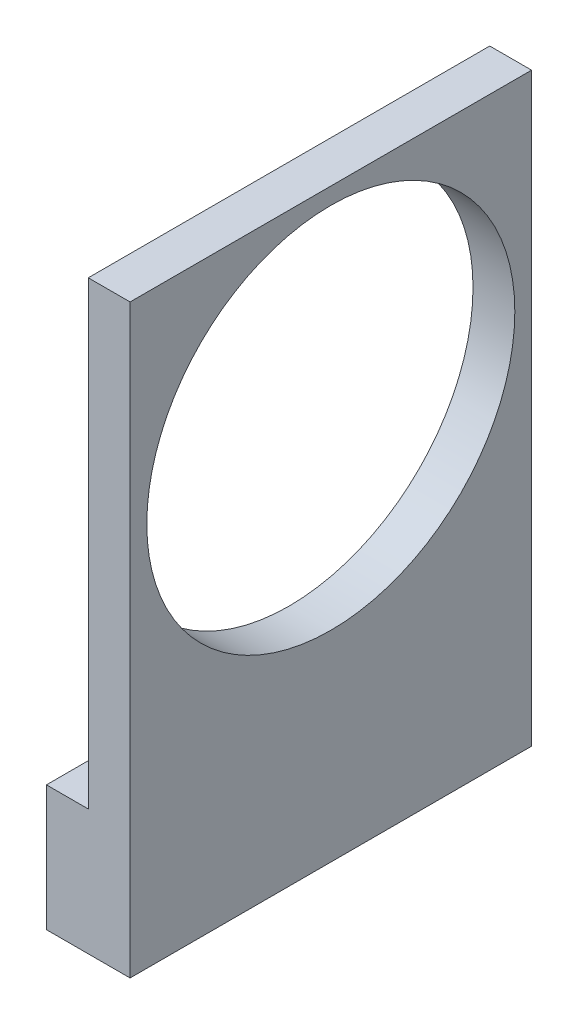
ISO-10303-21;
HEADER;
FILE_DESCRIPTION(('STEP AP214'),'2;1');
FILE_NAME('part.step','',(''),(''),'','','');
FILE_SCHEMA(('AUTOMOTIVE_DESIGN { 1 0 10303 214 1 1 1 1 }'));
ENDSEC;
DATA;
#1=APPLICATION_CONTEXT('core data for automotive mechanical design processes');
#2=APPLICATION_PROTOCOL_DEFINITION('international standard','automotive_design',2000,#1);
#3=PRODUCT_CONTEXT('',#1,'mechanical');
#4=PRODUCT('Part','Part','',(#3));
#5=PRODUCT_RELATED_PRODUCT_CATEGORY('part','',(#4));
#6=PRODUCT_DEFINITION_FORMATION('','',#4);
#7=PRODUCT_DEFINITION_CONTEXT('part definition',#1,'design');
#8=PRODUCT_DEFINITION('design','',#6,#7);
#9=PRODUCT_DEFINITION_SHAPE('','',#8);
#10=(LENGTH_UNIT() NAMED_UNIT(*) SI_UNIT(.MILLI.,.METRE.));
#11=(NAMED_UNIT(*) PLANE_ANGLE_UNIT() SI_UNIT($,.RADIAN.));
#12=(NAMED_UNIT(*) SI_UNIT($,.STERADIAN.) SOLID_ANGLE_UNIT());
#13=UNCERTAINTY_MEASURE_WITH_UNIT(LENGTH_MEASURE(1.E-05),#10,'distance_accuracy_value','');
#14=(GEOMETRIC_REPRESENTATION_CONTEXT(3) GLOBAL_UNCERTAINTY_ASSIGNED_CONTEXT((#13)) GLOBAL_UNIT_ASSIGNED_CONTEXT((#10,
#11,#12)) REPRESENTATION_CONTEXT('',''));
#15=CARTESIAN_POINT('',(0.,0.,0.));
#16=DIRECTION('',(0.,0.,1.));
#17=DIRECTION('',(1.,0.,0.));
#18=AXIS2_PLACEMENT_3D('',#15,#16,#17);
#19=CARTESIAN_POINT('',(10.,0.,0.));
#20=DIRECTION('',(-1.,0.,0.));
#21=DIRECTION('',(0.,0.,1.));
#22=AXIS2_PLACEMENT_3D('',#19,#20,#21);
#23=PLANE('',#22);
#24=DIRECTION('',(0.,-1.,0.));
#25=VECTOR('',#24,1.);
#26=CARTESIAN_POINT('',(10.,35.,24.));
#27=LINE('',#26,#25);
#28=CARTESIAN_POINT('',(10.,35.,24.));
#29=VERTEX_POINT('',#28);
#30=CARTESIAN_POINT('',(10.,-35.,24.));
#31=VERTEX_POINT('',#30);
#32=EDGE_CURVE('E142',#29,#31,#27,.T.);
#33=ORIENTED_EDGE('',*,*,#32,.T.);
#34=DIRECTION('',(0.,0.,-1.));
#35=VECTOR('',#34,1.);
#36=CARTESIAN_POINT('',(10.,-35.,-24.));
#37=LINE('',#36,#35);
#38=CARTESIAN_POINT('',(10.,-35.,-24.));
#39=VERTEX_POINT('',#38);
#40=EDGE_CURVE('E81',#31,#39,#37,.T.);
#41=ORIENTED_EDGE('',*,*,#40,.T.);
#42=DIRECTION('',(0.,1.,0.));
#43=VECTOR('',#42,1.);
#44=CARTESIAN_POINT('',(10.,35.,-24.));
#45=LINE('',#44,#43);
#46=CARTESIAN_POINT('',(10.,35.,-24.));
#47=VERTEX_POINT('',#46);
#48=EDGE_CURVE('E146',#39,#47,#45,.T.);
#49=ORIENTED_EDGE('',*,*,#48,.T.);
#50=DIRECTION('',(0.,0.,1.));
#51=VECTOR('',#50,1.);
#52=CARTESIAN_POINT('',(10.,35.,-24.));
#53=LINE('',#52,#51);
#54=EDGE_CURVE('E61',#47,#29,#53,.T.);
#55=ORIENTED_EDGE('',*,*,#54,.T.);
#56=EDGE_LOOP('',(#33,#41,#49,#55));
#57=FACE_BOUND('',#56,.T.);
#58=CARTESIAN_POINT('',(10.,11.,0.));
#59=DIRECTION('',(1.,0.,0.));
#60=DIRECTION('',(0.,0.,-1.));
#61=AXIS2_PLACEMENT_3D('',#58,#59,#60);
#62=CIRCLE('',#61,22.);
#63=CARTESIAN_POINT('',(10.,11.,-22.));
#64=VERTEX_POINT('',#63);
#65=EDGE_CURVE('E138',#64,#64,#62,.T.);
#66=ORIENTED_EDGE('',*,*,#65,.F.);
#67=EDGE_LOOP('',(#66));
#68=FACE_BOUND('',#67,.T.);
#69=ADVANCED_FACE('F36',(#57,#68),#23,.F.);
#70=CARTESIAN_POINT('',(0.,0.,0.));
#71=DIRECTION('',(-1.,0.,0.));
#72=DIRECTION('',(0.,0.,1.));
#73=AXIS2_PLACEMENT_3D('',#70,#71,#72);
#74=PLANE('',#73);
#75=DIRECTION('',(0.,0.,-1.));
#76=VECTOR('',#75,1.);
#77=CARTESIAN_POINT('',(0.,-20.,24.));
#78=LINE('',#77,#76);
#79=CARTESIAN_POINT('',(0.,-20.,24.));
#80=VERTEX_POINT('',#79);
#81=CARTESIAN_POINT('',(0.,-20.,-24.));
#82=VERTEX_POINT('',#81);
#83=EDGE_CURVE('E132',#80,#82,#78,.T.);
#84=ORIENTED_EDGE('',*,*,#83,.T.);
#85=DIRECTION('',(0.,1.,0.));
#86=VECTOR('',#85,1.);
#87=CARTESIAN_POINT('',(0.,35.,-24.));
#88=LINE('',#87,#86);
#89=CARTESIAN_POINT('',(0.,-35.,-24.));
#90=VERTEX_POINT('',#89);
#91=EDGE_CURVE('E144',#90,#82,#88,.T.);
#92=ORIENTED_EDGE('',*,*,#91,.F.);
#93=DIRECTION('',(0.,0.,-1.));
#94=VECTOR('',#93,1.);
#95=CARTESIAN_POINT('',(0.,-35.,-24.));
#96=LINE('',#95,#94);
#97=CARTESIAN_POINT('',(0.,-35.,24.));
#98=VERTEX_POINT('',#97);
#99=EDGE_CURVE('E76',#98,#90,#96,.T.);
#100=ORIENTED_EDGE('',*,*,#99,.F.);
#101=DIRECTION('',(0.,-1.,0.));
#102=VECTOR('',#101,1.);
#103=CARTESIAN_POINT('',(0.,35.,24.));
#104=LINE('',#103,#102);
#105=EDGE_CURVE('E141',#80,#98,#104,.T.);
#106=ORIENTED_EDGE('',*,*,#105,.F.);
#107=EDGE_LOOP('',(#84,#92,#100,#106));
#108=FACE_BOUND('',#107,.T.);
#109=ADVANCED_FACE('F166',(#108),#74,.T.);
#110=CARTESIAN_POINT('',(10.,35.,24.));
#111=DIRECTION('',(0.,0.,-1.));
#112=DIRECTION('',(0.,1.,0.));
#113=AXIS2_PLACEMENT_3D('',#110,#111,#112);
#114=PLANE('',#113);
#115=DIRECTION('',(0.,-1.,0.));
#116=VECTOR('',#115,1.);
#117=CARTESIAN_POINT('',(5.,35.,24.));
#118=LINE('',#117,#116);
#119=CARTESIAN_POINT('',(5.,35.,24.));
#120=VERTEX_POINT('',#119);
#121=CARTESIAN_POINT('',(4.99999999999999,-20.,24.));
#122=VERTEX_POINT('',#121);
#123=EDGE_CURVE('E52',#120,#122,#118,.T.);
#124=ORIENTED_EDGE('',*,*,#123,.T.);
#125=DIRECTION('',(-1.,0.,0.));
#126=VECTOR('',#125,1.);
#127=CARTESIAN_POINT('',(0.,-20.,24.));
#128=LINE('',#127,#126);
#129=EDGE_CURVE('E124',#122,#80,#128,.T.);
#130=ORIENTED_EDGE('',*,*,#129,.T.);
#131=ORIENTED_EDGE('',*,*,#105,.T.);
#132=DIRECTION('',(-1.,0.,0.));
#133=VECTOR('',#132,1.);
#134=CARTESIAN_POINT('',(10.,-35.,24.));
#135=LINE('',#134,#133);
#136=EDGE_CURVE('E11',#31,#98,#135,.T.);
#137=ORIENTED_EDGE('',*,*,#136,.F.);
#138=ORIENTED_EDGE('',*,*,#32,.F.);
#139=DIRECTION('',(-1.,0.,0.));
#140=VECTOR('',#139,1.);
#141=CARTESIAN_POINT('',(10.,35.,24.));
#142=LINE('',#141,#140);
#143=EDGE_CURVE('E149',#29,#120,#142,.T.);
#144=ORIENTED_EDGE('',*,*,#143,.T.);
#145=EDGE_LOOP('',(#124,#130,#131,#137,#138,#144));
#146=FACE_BOUND('',#145,.T.);
#147=ADVANCED_FACE('F38',(#146),#114,.F.);
#148=CARTESIAN_POINT('',(10.,-35.,-24.));
#149=DIRECTION('',(0.,1.,0.));
#150=DIRECTION('',(0.,0.,1.));
#151=AXIS2_PLACEMENT_3D('',#148,#149,#150);
#152=PLANE('',#151);
#153=CARTESIAN_POINT('',(5.,-35.,-19.));
#154=DIRECTION('',(0.,-1.,0.));
#155=DIRECTION('',(0.,0.,-1.));
#156=AXIS2_PLACEMENT_3D('',#153,#154,#155);
#157=CIRCLE('',#156,1.64999999999999);
#158=CARTESIAN_POINT('',(5.,-35.,-20.65));
#159=VERTEX_POINT('',#158);
#160=EDGE_CURVE('E112',#159,#159,#157,.T.);
#161=ORIENTED_EDGE('',*,*,#160,.F.);
#162=EDGE_LOOP('',(#161));
#163=FACE_BOUND('',#162,.T.);
#164=CARTESIAN_POINT('',(5.,-35.,19.));
#165=DIRECTION('',(0.,-1.,0.));
#166=DIRECTION('',(0.,0.,-1.));
#167=AXIS2_PLACEMENT_3D('',#164,#165,#166);
#168=CIRCLE('',#167,1.64999999999999);
#169=CARTESIAN_POINT('',(5.,-35.,17.35));
#170=VERTEX_POINT('',#169);
#171=EDGE_CURVE('E111',#170,#170,#168,.T.);
#172=ORIENTED_EDGE('',*,*,#171,.F.);
#173=EDGE_LOOP('',(#172));
#174=FACE_BOUND('',#173,.T.);
#175=ORIENTED_EDGE('',*,*,#99,.T.);
#176=DIRECTION('',(-1.,0.,0.));
#177=VECTOR('',#176,1.);
#178=CARTESIAN_POINT('',(10.,-35.,-24.));
#179=LINE('',#178,#177);
#180=EDGE_CURVE('E45',#39,#90,#179,.T.);
#181=ORIENTED_EDGE('',*,*,#180,.F.);
#182=ORIENTED_EDGE('',*,*,#40,.F.);
#183=ORIENTED_EDGE('',*,*,#136,.T.);
#184=EDGE_LOOP('',(#175,#181,#182,#183));
#185=FACE_BOUND('',#184,.T.);
#186=ADVANCED_FACE('F203',(#163,#174,#185),#152,.F.);
#187=CARTESIAN_POINT('',(10.,35.,-24.));
#188=DIRECTION('',(0.,0.,1.));
#189=DIRECTION('',(0.,-1.,0.));
#190=AXIS2_PLACEMENT_3D('',#187,#188,#189);
#191=PLANE('',#190);
#192=ORIENTED_EDGE('',*,*,#91,.T.);
#193=DIRECTION('',(-1.,0.,0.));
#194=VECTOR('',#193,1.);
#195=CARTESIAN_POINT('',(0.,-20.,-24.));
#196=LINE('',#195,#194);
#197=CARTESIAN_POINT('',(4.99999999999999,-20.,-24.));
#198=VERTEX_POINT('',#197);
#199=EDGE_CURVE('E125',#198,#82,#196,.T.);
#200=ORIENTED_EDGE('',*,*,#199,.F.);
#201=DIRECTION('',(0.,-1.,0.));
#202=VECTOR('',#201,1.);
#203=CARTESIAN_POINT('',(5.,35.,-24.));
#204=LINE('',#203,#202);
#205=CARTESIAN_POINT('',(5.,35.,-24.));
#206=VERTEX_POINT('',#205);
#207=EDGE_CURVE('E122',#206,#198,#204,.T.);
#208=ORIENTED_EDGE('',*,*,#207,.F.);
#209=DIRECTION('',(-1.,0.,0.));
#210=VECTOR('',#209,1.);
#211=CARTESIAN_POINT('',(10.,35.,-24.));
#212=LINE('',#211,#210);
#213=EDGE_CURVE('E156',#47,#206,#212,.T.);
#214=ORIENTED_EDGE('',*,*,#213,.F.);
#215=ORIENTED_EDGE('',*,*,#48,.F.);
#216=ORIENTED_EDGE('',*,*,#180,.T.);
#217=EDGE_LOOP('',(#192,#200,#208,#214,#215,#216));
#218=FACE_BOUND('',#217,.T.);
#219=ADVANCED_FACE('F162',(#218),#191,.F.);
#220=CARTESIAN_POINT('',(10.,35.,-24.));
#221=DIRECTION('',(0.,-1.,0.));
#222=DIRECTION('',(0.,0.,-1.));
#223=AXIS2_PLACEMENT_3D('',#220,#221,#222);
#224=PLANE('',#223);
#225=ORIENTED_EDGE('',*,*,#213,.T.);
#226=DIRECTION('',(0.,0.,-1.));
#227=VECTOR('',#226,1.);
#228=CARTESIAN_POINT('',(5.,35.,24.));
#229=LINE('',#228,#227);
#230=EDGE_CURVE('E128',#120,#206,#229,.T.);
#231=ORIENTED_EDGE('',*,*,#230,.F.);
#232=ORIENTED_EDGE('',*,*,#143,.F.);
#233=ORIENTED_EDGE('',*,*,#54,.F.);
#234=EDGE_LOOP('',(#225,#231,#232,#233));
#235=FACE_BOUND('',#234,.T.);
#236=ADVANCED_FACE('F175',(#235),#224,.F.);
#237=CARTESIAN_POINT('',(10.,11.,0.));
#238=DIRECTION('',(-1.,0.,0.));
#239=DIRECTION('',(0.,0.,1.));
#240=AXIS2_PLACEMENT_3D('',#237,#238,#239);
#241=CYLINDRICAL_SURFACE('',#240,22.);
#242=CARTESIAN_POINT('',(5.,11.,0.));
#243=DIRECTION('',(1.,0.,0.));
#244=DIRECTION('',(0.,1.,0.));
#245=AXIS2_PLACEMENT_3D('',#242,#243,#244);
#246=CIRCLE('',#245,22.);
#247=CARTESIAN_POINT('',(5.,33.,0.));
#248=VERTEX_POINT('',#247);
#249=EDGE_CURVE('E40',#248,#248,#246,.T.);
#250=ORIENTED_EDGE('',*,*,#249,.F.);
#251=EDGE_LOOP('',(#250));
#252=FACE_BOUND('',#251,.T.);
#253=ORIENTED_EDGE('',*,*,#65,.T.);
#254=EDGE_LOOP('',(#253));
#255=FACE_BOUND('',#254,.T.);
#256=ADVANCED_FACE('F188',(#252,#255),#241,.F.);
#257=CARTESIAN_POINT('',(0.,-20.,24.));
#258=DIRECTION('',(0.,-1.,0.));
#259=DIRECTION('',(0.,0.,-1.));
#260=AXIS2_PLACEMENT_3D('',#257,#258,#259);
#261=PLANE('',#260);
#262=ORIENTED_EDGE('',*,*,#199,.T.);
#263=ORIENTED_EDGE('',*,*,#83,.F.);
#264=ORIENTED_EDGE('',*,*,#129,.F.);
#265=DIRECTION('',(0.,0.,-1.));
#266=VECTOR('',#265,1.);
#267=CARTESIAN_POINT('',(4.99999999999999,-20.,24.));
#268=LINE('',#267,#266);
#269=EDGE_CURVE('E135',#122,#198,#268,.T.);
#270=ORIENTED_EDGE('',*,*,#269,.T.);
#271=EDGE_LOOP('',(#262,#263,#264,#270));
#272=FACE_BOUND('',#271,.T.);
#273=ADVANCED_FACE('F170',(#272),#261,.F.);
#274=CARTESIAN_POINT('',(5.,35.,24.));
#275=DIRECTION('',(1.,0.,0.));
#276=DIRECTION('',(0.,1.,0.));
#277=AXIS2_PLACEMENT_3D('',#274,#275,#276);
#278=PLANE('',#277);
#279=ORIENTED_EDGE('',*,*,#249,.T.);
#280=EDGE_LOOP('',(#279));
#281=FACE_BOUND('',#280,.T.);
#282=ORIENTED_EDGE('',*,*,#207,.T.);
#283=ORIENTED_EDGE('',*,*,#269,.F.);
#284=ORIENTED_EDGE('',*,*,#123,.F.);
#285=ORIENTED_EDGE('',*,*,#230,.T.);
#286=EDGE_LOOP('',(#282,#283,#284,#285));
#287=FACE_BOUND('',#286,.T.);
#288=ADVANCED_FACE('F177',(#281,#287),#278,.F.);
#289=CARTESIAN_POINT('',(5.,-25.,19.));
#290=DIRECTION('',(0.,-1.,0.));
#291=DIRECTION('',(0.,0.,-1.));
#292=AXIS2_PLACEMENT_3D('',#289,#290,#291);
#293=CONICAL_SURFACE('',#292,1.65,1.02974425867665);
#294=CARTESIAN_POINT('',(5.,-24.0085799786045,19.));
#295=VERTEX_POINT('',#294);
#296=VERTEX_LOOP('',#295);
#297=FACE_BOUND('',#296,.T.);
#298=CARTESIAN_POINT('',(5.,-25.,19.));
#299=DIRECTION('',(0.,-1.,0.));
#300=DIRECTION('',(0.,0.,-1.));
#301=AXIS2_PLACEMENT_3D('',#298,#299,#300);
#302=CIRCLE('',#301,1.65);
#303=CARTESIAN_POINT('',(5.,-25.,17.35));
#304=VERTEX_POINT('',#303);
#305=EDGE_CURVE('E115',#304,#304,#302,.T.);
#306=ORIENTED_EDGE('',*,*,#305,.T.);
#307=EDGE_LOOP('',(#306));
#308=FACE_BOUND('',#307,.T.);
#309=ADVANCED_FACE('F179',(#297,#308),#293,.F.);
#310=CARTESIAN_POINT('',(5.,-35.,19.));
#311=DIRECTION('',(0.,-1.,0.));
#312=DIRECTION('',(0.,0.,-1.));
#313=AXIS2_PLACEMENT_3D('',#310,#311,#312);
#314=CYLINDRICAL_SURFACE('',#313,1.64999999999999);
#315=ORIENTED_EDGE('',*,*,#305,.F.);
#316=EDGE_LOOP('',(#315));
#317=FACE_BOUND('',#316,.T.);
#318=ORIENTED_EDGE('',*,*,#171,.T.);
#319=EDGE_LOOP('',(#318));
#320=FACE_BOUND('',#319,.T.);
#321=ADVANCED_FACE('F105',(#317,#320),#314,.F.);
#322=CARTESIAN_POINT('',(5.,-25.,-19.));
#323=DIRECTION('',(0.,-1.,0.));
#324=DIRECTION('',(0.,0.,-1.));
#325=AXIS2_PLACEMENT_3D('',#322,#323,#324);
#326=CONICAL_SURFACE('',#325,1.65,1.02974425867665);
#327=CARTESIAN_POINT('',(5.,-24.0085799786045,-19.));
#328=VERTEX_POINT('',#327);
#329=VERTEX_LOOP('',#328);
#330=FACE_BOUND('',#329,.T.);
#331=CARTESIAN_POINT('',(5.,-25.,-19.));
#332=DIRECTION('',(0.,-1.,0.));
#333=DIRECTION('',(0.,0.,-1.));
#334=AXIS2_PLACEMENT_3D('',#331,#332,#333);
#335=CIRCLE('',#334,1.65);
#336=CARTESIAN_POINT('',(5.,-25.,-20.65));
#337=VERTEX_POINT('',#336);
#338=EDGE_CURVE('E109',#337,#337,#335,.T.);
#339=ORIENTED_EDGE('',*,*,#338,.T.);
#340=EDGE_LOOP('',(#339));
#341=FACE_BOUND('',#340,.T.);
#342=ADVANCED_FACE('F101',(#330,#341),#326,.F.);
#343=CARTESIAN_POINT('',(5.,-35.,-19.));
#344=DIRECTION('',(0.,-1.,0.));
#345=DIRECTION('',(0.,0.,-1.));
#346=AXIS2_PLACEMENT_3D('',#343,#344,#345);
#347=CYLINDRICAL_SURFACE('',#346,1.64999999999999);
#348=ORIENTED_EDGE('',*,*,#338,.F.);
#349=EDGE_LOOP('',(#348));
#350=FACE_BOUND('',#349,.T.);
#351=ORIENTED_EDGE('',*,*,#160,.T.);
#352=EDGE_LOOP('',(#351));
#353=FACE_BOUND('',#352,.T.);
#354=ADVANCED_FACE('F104',(#350,#353),#347,.F.);
#355=CLOSED_SHELL('',(#69,#109,#147,#186,#219,#236,#256,#273,#288,#309,#321,#342,#354));
#356=MANIFOLD_SOLID_BREP('B2',#355);
#357=ADVANCED_BREP_SHAPE_REPRESENTATION('',(#18,#356),#14);
#358=SHAPE_DEFINITION_REPRESENTATION(#9,#357);
ENDSEC;
END-ISO-10303-21;
